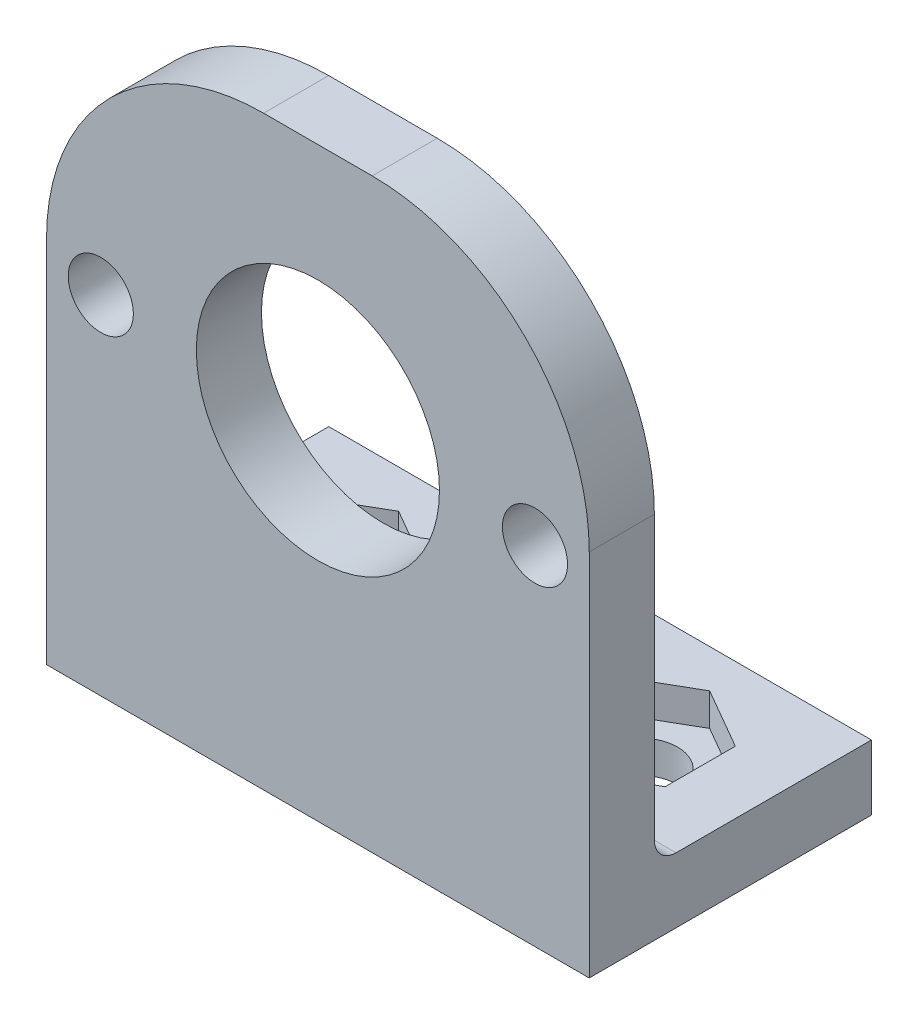
ISO-10303-21;
HEADER;
FILE_DESCRIPTION(('STEP AP214'),'2;1');
FILE_NAME('part.step','',(''),(''),'','','');
FILE_SCHEMA(('AUTOMOTIVE_DESIGN { 1 0 10303 214 1 1 1 1 }'));
ENDSEC;
DATA;
#1=APPLICATION_CONTEXT('core data for automotive mechanical design processes');
#2=APPLICATION_PROTOCOL_DEFINITION('international standard','automotive_design',2000,#1);
#3=PRODUCT_CONTEXT('',#1,'mechanical');
#4=PRODUCT('Part','Part','',(#3));
#5=PRODUCT_RELATED_PRODUCT_CATEGORY('part','',(#4));
#6=PRODUCT_DEFINITION_FORMATION('','',#4);
#7=PRODUCT_DEFINITION_CONTEXT('part definition',#1,'design');
#8=PRODUCT_DEFINITION('design','',#6,#7);
#9=PRODUCT_DEFINITION_SHAPE('','',#8);
#10=(LENGTH_UNIT() NAMED_UNIT(*) SI_UNIT(.MILLI.,.METRE.));
#11=(NAMED_UNIT(*) PLANE_ANGLE_UNIT() SI_UNIT($,.RADIAN.));
#12=(NAMED_UNIT(*) SI_UNIT($,.STERADIAN.) SOLID_ANGLE_UNIT());
#13=UNCERTAINTY_MEASURE_WITH_UNIT(LENGTH_MEASURE(1.E-05),#10,'distance_accuracy_value','');
#14=(GEOMETRIC_REPRESENTATION_CONTEXT(3) GLOBAL_UNCERTAINTY_ASSIGNED_CONTEXT((#13)) GLOBAL_UNIT_ASSIGNED_CONTEXT((#10,
#11,#12)) REPRESENTATION_CONTEXT('',''));
#15=CARTESIAN_POINT('',(0.,0.,0.));
#16=DIRECTION('',(0.,0.,1.));
#17=DIRECTION('',(1.,0.,0.));
#18=AXIS2_PLACEMENT_3D('',#15,#16,#17);
#19=CARTESIAN_POINT('',(6.81278026529184,-3.5,-5.));
#20=DIRECTION('',(0.,-1.,0.));
#21=DIRECTION('',(0.,0.,-1.));
#22=AXIS2_PLACEMENT_3D('',#19,#20,#21);
#23=CYLINDRICAL_SURFACE('',#22,1.75);
#24=CARTESIAN_POINT('',(6.81278026529184,-13.5,-5.));
#25=DIRECTION('',(0.,-1.,0.));
#26=DIRECTION('',(0.,0.,-1.));
#27=AXIS2_PLACEMENT_3D('',#24,#25,#26);
#28=CIRCLE('',#27,1.75);
#29=CARTESIAN_POINT('',(6.81278026529184,-13.5,-6.75));
#30=VERTEX_POINT('',#29);
#31=EDGE_CURVE('E288',#30,#30,#28,.T.);
#32=ORIENTED_EDGE('',*,*,#31,.T.);
#33=EDGE_LOOP('',(#32));
#34=FACE_BOUND('',#33,.T.);
#35=CARTESIAN_POINT('',(6.81278026529184,-12.0039970332876,-5.));
#36=DIRECTION('',(0.,1.,0.));
#37=DIRECTION('',(0.,0.,1.));
#38=AXIS2_PLACEMENT_3D('',#35,#36,#37);
#39=CIRCLE('',#38,1.75);
#40=CARTESIAN_POINT('',(6.81278026529184,-12.0039970332876,-3.25));
#41=VERTEX_POINT('',#40);
#42=EDGE_CURVE('E39',#41,#41,#39,.F.);
#43=ORIENTED_EDGE('',*,*,#42,.F.);
#44=EDGE_LOOP('',(#43));
#45=FACE_BOUND('',#44,.T.);
#46=ADVANCED_FACE('F35',(#34,#45),#23,.F.);
#47=CARTESIAN_POINT('',(-7.51338532803462,-3.5,-5.));
#48=DIRECTION('',(0.,-1.,0.));
#49=DIRECTION('',(0.,0.,-1.));
#50=AXIS2_PLACEMENT_3D('',#47,#48,#49);
#51=CYLINDRICAL_SURFACE('',#50,1.75);
#52=CARTESIAN_POINT('',(-7.51338532803462,-13.5,-5.));
#53=DIRECTION('',(0.,-1.,0.));
#54=DIRECTION('',(0.,0.,-1.));
#55=AXIS2_PLACEMENT_3D('',#52,#53,#54);
#56=CIRCLE('',#55,1.75);
#57=CARTESIAN_POINT('',(-7.51338532803462,-13.5,-6.75));
#58=VERTEX_POINT('',#57);
#59=EDGE_CURVE('E284',#58,#58,#56,.T.);
#60=ORIENTED_EDGE('',*,*,#59,.T.);
#61=EDGE_LOOP('',(#60));
#62=FACE_BOUND('',#61,.T.);
#63=CARTESIAN_POINT('',(-7.51338532803462,-12.0039970332876,-5.));
#64=DIRECTION('',(0.,1.,0.));
#65=DIRECTION('',(0.,0.,1.));
#66=AXIS2_PLACEMENT_3D('',#63,#64,#65);
#67=CIRCLE('',#66,1.75);
#68=CARTESIAN_POINT('',(-7.51338532803462,-12.0039970332876,-3.25));
#69=VERTEX_POINT('',#68);
#70=EDGE_CURVE('E231',#69,#69,#67,.F.);
#71=ORIENTED_EDGE('',*,*,#70,.F.);
#72=EDGE_LOOP('',(#71));
#73=FACE_BOUND('',#72,.T.);
#74=ADVANCED_FACE('F365',(#62,#73),#51,.F.);
#75=CARTESIAN_POINT('',(0.,0.,0.));
#76=DIRECTION('',(0.,0.,1.));
#77=DIRECTION('',(1.,0.,0.));
#78=AXIS2_PLACEMENT_3D('',#75,#76,#77);
#79=PLANE('',#78);
#80=CARTESIAN_POINT('',(-10.,2.5,0.));
#81=DIRECTION('',(0.,0.,1.));
#82=DIRECTION('',(1.,0.,0.));
#83=AXIS2_PLACEMENT_3D('',#80,#81,#82);
#84=CIRCLE('',#83,1.5);
#85=CARTESIAN_POINT('',(-8.5,2.5,0.));
#86=VERTEX_POINT('',#85);
#87=EDGE_CURVE('E207',#86,#86,#84,.T.);
#88=ORIENTED_EDGE('',*,*,#87,.T.);
#89=EDGE_LOOP('',(#88));
#90=FACE_BOUND('',#89,.T.);
#91=CARTESIAN_POINT('',(10.,2.5,0.));
#92=DIRECTION('',(0.,0.,1.));
#93=DIRECTION('',(1.,0.,0.));
#94=AXIS2_PLACEMENT_3D('',#91,#92,#93);
#95=CIRCLE('',#94,1.5);
#96=CARTESIAN_POINT('',(11.5,2.5,0.));
#97=VERTEX_POINT('',#96);
#98=EDGE_CURVE('E535',#97,#97,#95,.T.);
#99=ORIENTED_EDGE('',*,*,#98,.T.);
#100=EDGE_LOOP('',(#99));
#101=FACE_BOUND('',#100,.T.);
#102=CARTESIAN_POINT('',(0.,2.5,0.));
#103=DIRECTION('',(0.,0.,1.));
#104=DIRECTION('',(1.,0.,0.));
#105=AXIS2_PLACEMENT_3D('',#102,#103,#104);
#106=CIRCLE('',#105,5.6);
#107=CARTESIAN_POINT('',(5.6,2.5,0.));
#108=VERTEX_POINT('',#107);
#109=EDGE_CURVE('E293',#108,#108,#106,.T.);
#110=ORIENTED_EDGE('',*,*,#109,.T.);
#111=EDGE_LOOP('',(#110));
#112=FACE_BOUND('',#111,.T.);
#113=DIRECTION('',(0.,1.,0.));
#114=VECTOR('',#113,1.);
#115=CARTESIAN_POINT('',(12.5,13.5,0.));
#116=LINE('',#115,#114);
#117=CARTESIAN_POINT('',(12.5,-9.50399703328757,0.));
#118=VERTEX_POINT('',#117);
#119=CARTESIAN_POINT('',(12.5,3.5,0.));
#120=VERTEX_POINT('',#119);
#121=EDGE_CURVE('E312',#118,#120,#116,.T.);
#122=ORIENTED_EDGE('',*,*,#121,.F.);
#123=DIRECTION('',(1.,0.,0.));
#124=VECTOR('',#123,1.);
#125=CARTESIAN_POINT('',(-12.5,-9.50399703328757,0.));
#126=LINE('',#125,#124);
#127=CARTESIAN_POINT('',(-12.5,-9.50399703328757,0.));
#128=VERTEX_POINT('',#127);
#129=EDGE_CURVE('E356',#118,#128,#126,.F.);
#130=ORIENTED_EDGE('',*,*,#129,.T.);
#131=DIRECTION('',(0.,-1.,0.));
#132=VECTOR('',#131,1.);
#133=CARTESIAN_POINT('',(-12.5,13.5,0.));
#134=LINE('',#133,#132);
#135=CARTESIAN_POINT('',(-12.5,3.5,0.));
#136=VERTEX_POINT('',#135);
#137=EDGE_CURVE('E317',#136,#128,#134,.T.);
#138=ORIENTED_EDGE('',*,*,#137,.F.);
#139=CARTESIAN_POINT('',(-2.5,3.5,0.));
#140=DIRECTION('',(0.,0.,1.));
#141=DIRECTION('',(1.,0.,0.));
#142=AXIS2_PLACEMENT_3D('',#139,#140,#141);
#143=CIRCLE('',#142,10.);
#144=CARTESIAN_POINT('',(-2.5,13.5,0.));
#145=VERTEX_POINT('',#144);
#146=EDGE_CURVE('E339',#136,#145,#143,.F.);
#147=ORIENTED_EDGE('',*,*,#146,.T.);
#148=DIRECTION('',(-1.,0.,0.));
#149=VECTOR('',#148,1.);
#150=CARTESIAN_POINT('',(-12.5,13.5,0.));
#151=LINE('',#150,#149);
#152=CARTESIAN_POINT('',(2.5,13.5,0.));
#153=VERTEX_POINT('',#152);
#154=EDGE_CURVE('E326',#153,#145,#151,.T.);
#155=ORIENTED_EDGE('',*,*,#154,.F.);
#156=CARTESIAN_POINT('',(2.5,3.5,0.));
#157=DIRECTION('',(0.,0.,1.));
#158=DIRECTION('',(1.,0.,0.));
#159=AXIS2_PLACEMENT_3D('',#156,#157,#158);
#160=CIRCLE('',#159,10.);
#161=EDGE_CURVE('E341',#153,#120,#160,.F.);
#162=ORIENTED_EDGE('',*,*,#161,.T.);
#163=EDGE_LOOP('',(#122,#130,#138,#147,#155,#162));
#164=FACE_BOUND('',#163,.T.);
#165=ADVANCED_FACE('F371',(#90,#101,#112,#164),#79,.F.);
#166=CARTESIAN_POINT('',(12.5,13.5,3.));
#167=DIRECTION('',(-1.,0.,0.));
#168=DIRECTION('',(0.,-1.,0.));
#169=AXIS2_PLACEMENT_3D('',#166,#167,#168);
#170=PLANE('',#169);
#171=DIRECTION('',(0.,0.,1.));
#172=VECTOR('',#171,1.);
#173=CARTESIAN_POINT('',(12.5,-10.5039970332876,-10.));
#174=LINE('',#173,#172);
#175=CARTESIAN_POINT('',(12.5,-10.5039970332876,-10.));
#176=VERTEX_POINT('',#175);
#177=CARTESIAN_POINT('',(12.5,-10.5039970332876,-0.999999999999999));
#178=VERTEX_POINT('',#177);
#179=EDGE_CURVE('E306',#176,#178,#174,.T.);
#180=ORIENTED_EDGE('',*,*,#179,.T.);
#181=CARTESIAN_POINT('',(12.5,-9.50399703328757,-0.999999999999999));
#182=DIRECTION('',(-1.,0.,0.));
#183=DIRECTION('',(0.,-1.,0.));
#184=AXIS2_PLACEMENT_3D('',#181,#182,#183);
#185=CIRCLE('',#184,1.);
#186=EDGE_CURVE('E44',#178,#118,#185,.T.);
#187=ORIENTED_EDGE('',*,*,#186,.T.);
#188=ORIENTED_EDGE('',*,*,#121,.T.);
#189=DIRECTION('',(0.,0.,-1.));
#190=VECTOR('',#189,1.);
#191=CARTESIAN_POINT('',(12.5,3.5,3.));
#192=LINE('',#191,#190);
#193=CARTESIAN_POINT('',(12.5,3.5,3.));
#194=VERTEX_POINT('',#193);
#195=EDGE_CURVE('E344',#120,#194,#192,.F.);
#196=ORIENTED_EDGE('',*,*,#195,.T.);
#197=DIRECTION('',(0.,1.,0.));
#198=VECTOR('',#197,1.);
#199=CARTESIAN_POINT('',(12.5,13.5,3.));
#200=LINE('',#199,#198);
#201=CARTESIAN_POINT('',(12.5,-13.5,3.));
#202=VERTEX_POINT('',#201);
#203=EDGE_CURVE('E313',#202,#194,#200,.T.);
#204=ORIENTED_EDGE('',*,*,#203,.F.);
#205=DIRECTION('',(0.,0.,-1.));
#206=VECTOR('',#205,1.);
#207=CARTESIAN_POINT('',(12.5,-13.5,3.));
#208=LINE('',#207,#206);
#209=CARTESIAN_POINT('',(12.5,-13.5,-10.));
#210=VERTEX_POINT('',#209);
#211=EDGE_CURVE('E324',#202,#210,#208,.T.);
#212=ORIENTED_EDGE('',*,*,#211,.T.);
#213=DIRECTION('',(0.,-1.,0.));
#214=VECTOR('',#213,1.);
#215=CARTESIAN_POINT('',(12.5,-13.5,-10.));
#216=LINE('',#215,#214);
#217=EDGE_CURVE('E296',#176,#210,#216,.T.);
#218=ORIENTED_EDGE('',*,*,#217,.F.);
#219=EDGE_LOOP('',(#180,#187,#188,#196,#204,#212,#218));
#220=FACE_BOUND('',#219,.T.);
#221=ADVANCED_FACE('F396',(#220),#170,.F.);
#222=CARTESIAN_POINT('',(-12.5,13.5,3.));
#223=DIRECTION('',(0.,-1.,0.));
#224=DIRECTION('',(0.,0.,-1.));
#225=AXIS2_PLACEMENT_3D('',#222,#223,#224);
#226=PLANE('',#225);
#227=DIRECTION('',(-1.,0.,0.));
#228=VECTOR('',#227,1.);
#229=CARTESIAN_POINT('',(-12.5,13.5,3.));
#230=LINE('',#229,#228);
#231=CARTESIAN_POINT('',(2.5,13.5,3.));
#232=VERTEX_POINT('',#231);
#233=CARTESIAN_POINT('',(-2.5,13.5,3.));
#234=VERTEX_POINT('',#233);
#235=EDGE_CURVE('E316',#232,#234,#230,.T.);
#236=ORIENTED_EDGE('',*,*,#235,.F.);
#237=DIRECTION('',(0.,0.,-1.));
#238=VECTOR('',#237,1.);
#239=CARTESIAN_POINT('',(2.5,13.5,3.));
#240=LINE('',#239,#238);
#241=EDGE_CURVE('E336',#232,#153,#240,.T.);
#242=ORIENTED_EDGE('',*,*,#241,.T.);
#243=ORIENTED_EDGE('',*,*,#154,.T.);
#244=DIRECTION('',(0.,0.,-1.));
#245=VECTOR('',#244,1.);
#246=CARTESIAN_POINT('',(-2.5,13.5,3.));
#247=LINE('',#246,#245);
#248=EDGE_CURVE('E334',#145,#234,#247,.F.);
#249=ORIENTED_EDGE('',*,*,#248,.T.);
#250=EDGE_LOOP('',(#236,#242,#243,#249));
#251=FACE_BOUND('',#250,.T.);
#252=ADVANCED_FACE('F404',(#251),#226,.F.);
#253=CARTESIAN_POINT('',(-12.5,13.5,3.));
#254=DIRECTION('',(1.,0.,0.));
#255=DIRECTION('',(0.,1.,0.));
#256=AXIS2_PLACEMENT_3D('',#253,#254,#255);
#257=PLANE('',#256);
#258=DIRECTION('',(0.,-1.,0.));
#259=VECTOR('',#258,1.);
#260=CARTESIAN_POINT('',(-12.5,13.5,3.));
#261=LINE('',#260,#259);
#262=CARTESIAN_POINT('',(-12.5,3.5,3.));
#263=VERTEX_POINT('',#262);
#264=CARTESIAN_POINT('',(-12.5,-13.5,3.));
#265=VERTEX_POINT('',#264);
#266=EDGE_CURVE('E320',#263,#265,#261,.T.);
#267=ORIENTED_EDGE('',*,*,#266,.F.);
#268=DIRECTION('',(0.,0.,-1.));
#269=VECTOR('',#268,1.);
#270=CARTESIAN_POINT('',(-12.5,3.5,3.));
#271=LINE('',#270,#269);
#272=EDGE_CURVE('E350',#263,#136,#271,.T.);
#273=ORIENTED_EDGE('',*,*,#272,.T.);
#274=ORIENTED_EDGE('',*,*,#137,.T.);
#275=CARTESIAN_POINT('',(-12.5,-9.50399703328757,-0.999999999999999));
#276=DIRECTION('',(1.,0.,0.));
#277=DIRECTION('',(0.,1.,0.));
#278=AXIS2_PLACEMENT_3D('',#275,#276,#277);
#279=CIRCLE('',#278,1.);
#280=CARTESIAN_POINT('',(-12.5,-10.5039970332876,-0.999999999999999));
#281=VERTEX_POINT('',#280);
#282=EDGE_CURVE('E11',#128,#281,#279,.T.);
#283=ORIENTED_EDGE('',*,*,#282,.T.);
#284=DIRECTION('',(0.,0.,1.));
#285=VECTOR('',#284,1.);
#286=CARTESIAN_POINT('',(-12.5,-10.5039970332876,-10.));
#287=LINE('',#286,#285);
#288=CARTESIAN_POINT('',(-12.5,-10.5039970332876,-10.));
#289=VERTEX_POINT('',#288);
#290=EDGE_CURVE('E309',#289,#281,#287,.T.);
#291=ORIENTED_EDGE('',*,*,#290,.F.);
#292=DIRECTION('',(0.,1.,0.));
#293=VECTOR('',#292,1.);
#294=CARTESIAN_POINT('',(-12.5,-13.5,-10.));
#295=LINE('',#294,#293);
#296=CARTESIAN_POINT('',(-12.5,-13.5,-10.));
#297=VERTEX_POINT('',#296);
#298=EDGE_CURVE('E302',#297,#289,#295,.T.);
#299=ORIENTED_EDGE('',*,*,#298,.F.);
#300=DIRECTION('',(0.,0.,-1.));
#301=VECTOR('',#300,1.);
#302=CARTESIAN_POINT('',(-12.5,-13.5,3.));
#303=LINE('',#302,#301);
#304=EDGE_CURVE('E332',#265,#297,#303,.T.);
#305=ORIENTED_EDGE('',*,*,#304,.F.);
#306=EDGE_LOOP('',(#267,#273,#274,#283,#291,#299,#305));
#307=FACE_BOUND('',#306,.T.);
#308=ADVANCED_FACE('F400',(#307),#257,.F.);
#309=CARTESIAN_POINT('',(-12.5,-13.5,3.));
#310=DIRECTION('',(0.,1.,0.));
#311=DIRECTION('',(0.,0.,1.));
#312=AXIS2_PLACEMENT_3D('',#309,#310,#311);
#313=PLANE('',#312);
#314=ORIENTED_EDGE('',*,*,#59,.F.);
#315=EDGE_LOOP('',(#314));
#316=FACE_BOUND('',#315,.T.);
#317=ORIENTED_EDGE('',*,*,#31,.F.);
#318=EDGE_LOOP('',(#317));
#319=FACE_BOUND('',#318,.T.);
#320=ORIENTED_EDGE('',*,*,#304,.T.);
#321=DIRECTION('',(-1.,0.,0.));
#322=VECTOR('',#321,1.);
#323=CARTESIAN_POINT('',(12.5,-13.5,-10.));
#324=LINE('',#323,#322);
#325=EDGE_CURVE('E299',#210,#297,#324,.T.);
#326=ORIENTED_EDGE('',*,*,#325,.F.);
#327=ORIENTED_EDGE('',*,*,#211,.F.);
#328=DIRECTION('',(1.,0.,0.));
#329=VECTOR('',#328,1.);
#330=CARTESIAN_POINT('',(-12.5,-13.5,3.));
#331=LINE('',#330,#329);
#332=EDGE_CURVE('E322',#265,#202,#331,.T.);
#333=ORIENTED_EDGE('',*,*,#332,.F.);
#334=EDGE_LOOP('',(#320,#326,#327,#333));
#335=FACE_BOUND('',#334,.T.);
#336=ADVANCED_FACE('F392',(#316,#319,#335),#313,.F.);
#337=CARTESIAN_POINT('',(0.,0.,3.));
#338=DIRECTION('',(0.,0.,1.));
#339=DIRECTION('',(1.,0.,0.));
#340=AXIS2_PLACEMENT_3D('',#337,#338,#339);
#341=PLANE('',#340);
#342=CARTESIAN_POINT('',(-10.,2.5,3.));
#343=DIRECTION('',(0.,0.,1.));
#344=DIRECTION('',(1.,0.,0.));
#345=AXIS2_PLACEMENT_3D('',#342,#343,#344);
#346=CIRCLE('',#345,1.5);
#347=CARTESIAN_POINT('',(-8.5,2.5,3.));
#348=VERTEX_POINT('',#347);
#349=EDGE_CURVE('E537',#348,#348,#346,.T.);
#350=ORIENTED_EDGE('',*,*,#349,.F.);
#351=EDGE_LOOP('',(#350));
#352=FACE_BOUND('',#351,.T.);
#353=CARTESIAN_POINT('',(10.,2.5,3.));
#354=DIRECTION('',(0.,0.,1.));
#355=DIRECTION('',(1.,0.,0.));
#356=AXIS2_PLACEMENT_3D('',#353,#354,#355);
#357=CIRCLE('',#356,1.5);
#358=CARTESIAN_POINT('',(11.5,2.5,3.));
#359=VERTEX_POINT('',#358);
#360=EDGE_CURVE('E532',#359,#359,#357,.T.);
#361=ORIENTED_EDGE('',*,*,#360,.F.);
#362=EDGE_LOOP('',(#361));
#363=FACE_BOUND('',#362,.T.);
#364=CARTESIAN_POINT('',(0.,2.5,3.));
#365=DIRECTION('',(0.,0.,1.));
#366=DIRECTION('',(1.,0.,0.));
#367=AXIS2_PLACEMENT_3D('',#364,#365,#366);
#368=CIRCLE('',#367,5.6);
#369=CARTESIAN_POINT('',(5.6,2.5,3.));
#370=VERTEX_POINT('',#369);
#371=EDGE_CURVE('E287',#370,#370,#368,.T.);
#372=ORIENTED_EDGE('',*,*,#371,.F.);
#373=EDGE_LOOP('',(#372));
#374=FACE_BOUND('',#373,.T.);
#375=ORIENTED_EDGE('',*,*,#203,.T.);
#376=CARTESIAN_POINT('',(2.5,3.5,3.));
#377=DIRECTION('',(0.,0.,1.));
#378=DIRECTION('',(1.,0.,0.));
#379=AXIS2_PLACEMENT_3D('',#376,#377,#378);
#380=CIRCLE('',#379,10.);
#381=EDGE_CURVE('E348',#194,#232,#380,.T.);
#382=ORIENTED_EDGE('',*,*,#381,.T.);
#383=ORIENTED_EDGE('',*,*,#235,.T.);
#384=CARTESIAN_POINT('',(-2.5,3.5,3.));
#385=DIRECTION('',(0.,0.,1.));
#386=DIRECTION('',(1.,0.,0.));
#387=AXIS2_PLACEMENT_3D('',#384,#385,#386);
#388=CIRCLE('',#387,10.);
#389=EDGE_CURVE('E346',#234,#263,#388,.T.);
#390=ORIENTED_EDGE('',*,*,#389,.T.);
#391=ORIENTED_EDGE('',*,*,#266,.T.);
#392=ORIENTED_EDGE('',*,*,#332,.T.);
#393=EDGE_LOOP('',(#375,#382,#383,#390,#391,#392));
#394=FACE_BOUND('',#393,.T.);
#395=ADVANCED_FACE('F388',(#352,#363,#374,#394),#341,.T.);
#396=CARTESIAN_POINT('',(12.5,-10.5039970332876,-10.));
#397=DIRECTION('',(0.,-1.,0.));
#398=DIRECTION('',(0.,0.,-1.));
#399=AXIS2_PLACEMENT_3D('',#396,#397,#398);
#400=PLANE('',#399);
#401=DIRECTION('',(0.,0.,-1.));
#402=VECTOR('',#401,1.);
#403=CARTESIAN_POINT('',(9.61278026529184,-10.5039970332876,-3.38341924626905));
#404=LINE('',#403,#402);
#405=CARTESIAN_POINT('',(9.61278026529184,-10.5039970332876,-3.38341924626905));
#406=VERTEX_POINT('',#405);
#407=CARTESIAN_POINT('',(9.61278026529184,-10.5039970332876,-6.61658075373095));
#408=VERTEX_POINT('',#407);
#409=EDGE_CURVE('E218',#406,#408,#404,.T.);
#410=ORIENTED_EDGE('',*,*,#409,.F.);
#411=DIRECTION('',(0.866025403784439,0.,-0.5));
#412=VECTOR('',#411,1.);
#413=CARTESIAN_POINT('',(6.81278026529184,-10.5039970332876,-1.76683849253809));
#414=LINE('',#413,#412);
#415=CARTESIAN_POINT('',(6.81278026529184,-10.5039970332876,-1.76683849253809));
#416=VERTEX_POINT('',#415);
#417=EDGE_CURVE('E52',#416,#406,#414,.T.);
#418=ORIENTED_EDGE('',*,*,#417,.F.);
#419=DIRECTION('',(0.866025403784439,0.,0.5));
#420=VECTOR('',#419,1.);
#421=CARTESIAN_POINT('',(4.01278026529184,-10.5039970332876,-3.38341924626905));
#422=LINE('',#421,#420);
#423=CARTESIAN_POINT('',(4.01278026529184,-10.5039970332876,-3.38341924626905));
#424=VERTEX_POINT('',#423);
#425=EDGE_CURVE('E201',#424,#416,#422,.T.);
#426=ORIENTED_EDGE('',*,*,#425,.F.);
#427=DIRECTION('',(0.,0.,1.));
#428=VECTOR('',#427,1.);
#429=CARTESIAN_POINT('',(4.01278026529184,-10.5039970332876,-6.61658075373096));
#430=LINE('',#429,#428);
#431=CARTESIAN_POINT('',(4.01278026529184,-10.5039970332876,-6.61658075373096));
#432=VERTEX_POINT('',#431);
#433=EDGE_CURVE('E204',#432,#424,#430,.T.);
#434=ORIENTED_EDGE('',*,*,#433,.F.);
#435=DIRECTION('',(-0.866025403784439,0.,0.5));
#436=VECTOR('',#435,1.);
#437=CARTESIAN_POINT('',(6.81278026529184,-10.5039970332876,-8.23316150746191));
#438=LINE('',#437,#436);
#439=CARTESIAN_POINT('',(6.81278026529184,-10.5039970332876,-8.23316150746191));
#440=VERTEX_POINT('',#439);
#441=EDGE_CURVE('E224',#440,#432,#438,.T.);
#442=ORIENTED_EDGE('',*,*,#441,.F.);
#443=DIRECTION('',(-0.866025403784439,0.,-0.5));
#444=VECTOR('',#443,1.);
#445=CARTESIAN_POINT('',(9.61278026529184,-10.5039970332876,-6.61658075373095));
#446=LINE('',#445,#444);
#447=EDGE_CURVE('E221',#408,#440,#446,.T.);
#448=ORIENTED_EDGE('',*,*,#447,.F.);
#449=EDGE_LOOP('',(#410,#418,#426,#434,#442,#448));
#450=FACE_BOUND('',#449,.T.);
#451=DIRECTION('',(0.,0.,-1.));
#452=VECTOR('',#451,1.);
#453=CARTESIAN_POINT('',(-4.71338532803462,-10.5039970332876,-3.38341924626905));
#454=LINE('',#453,#452);
#455=CARTESIAN_POINT('',(-4.71338532803462,-10.5039970332876,-3.38341924626905));
#456=VERTEX_POINT('',#455);
#457=CARTESIAN_POINT('',(-4.71338532803462,-10.5039970332876,-6.61658075373096));
#458=VERTEX_POINT('',#457);
#459=EDGE_CURVE('E260',#456,#458,#454,.T.);
#460=ORIENTED_EDGE('',*,*,#459,.F.);
#461=DIRECTION('',(0.866025403784439,0.,-0.5));
#462=VECTOR('',#461,1.);
#463=CARTESIAN_POINT('',(-7.51338532803462,-10.5039970332876,-1.7668384925381));
#464=LINE('',#463,#462);
#465=CARTESIAN_POINT('',(-7.51338532803462,-10.5039970332876,-1.7668384925381));
#466=VERTEX_POINT('',#465);
#467=EDGE_CURVE('E60',#466,#456,#464,.T.);
#468=ORIENTED_EDGE('',*,*,#467,.F.);
#469=DIRECTION('',(0.866025403784438,0.,0.5));
#470=VECTOR('',#469,1.);
#471=CARTESIAN_POINT('',(-10.3133853280346,-10.5039970332876,-3.38341924626905));
#472=LINE('',#471,#470);
#473=CARTESIAN_POINT('',(-10.3133853280346,-10.5039970332876,-3.38341924626905));
#474=VERTEX_POINT('',#473);
#475=EDGE_CURVE('E243',#474,#466,#472,.T.);
#476=ORIENTED_EDGE('',*,*,#475,.F.);
#477=DIRECTION('',(0.,0.,1.));
#478=VECTOR('',#477,1.);
#479=CARTESIAN_POINT('',(-10.3133853280346,-10.5039970332876,-6.61658075373095));
#480=LINE('',#479,#478);
#481=CARTESIAN_POINT('',(-10.3133853280346,-10.5039970332876,-6.61658075373095));
#482=VERTEX_POINT('',#481);
#483=EDGE_CURVE('E269',#482,#474,#480,.T.);
#484=ORIENTED_EDGE('',*,*,#483,.F.);
#485=DIRECTION('',(-0.866025403784439,0.,0.5));
#486=VECTOR('',#485,1.);
#487=CARTESIAN_POINT('',(-7.51338532803462,-10.5039970332876,-8.23316150746191));
#488=LINE('',#487,#486);
#489=CARTESIAN_POINT('',(-7.51338532803462,-10.5039970332876,-8.23316150746191));
#490=VERTEX_POINT('',#489);
#491=EDGE_CURVE('E266',#490,#482,#488,.T.);
#492=ORIENTED_EDGE('',*,*,#491,.F.);
#493=DIRECTION('',(-0.866025403784438,0.,-0.5));
#494=VECTOR('',#493,1.);
#495=CARTESIAN_POINT('',(-4.71338532803462,-10.5039970332876,-6.61658075373096));
#496=LINE('',#495,#494);
#497=EDGE_CURVE('E263',#458,#490,#496,.T.);
#498=ORIENTED_EDGE('',*,*,#497,.F.);
#499=EDGE_LOOP('',(#460,#468,#476,#484,#492,#498));
#500=FACE_BOUND('',#499,.T.);
#501=ORIENTED_EDGE('',*,*,#290,.T.);
#502=DIRECTION('',(1.,0.,0.));
#503=VECTOR('',#502,1.);
#504=CARTESIAN_POINT('',(12.5,-10.5039970332876,-0.999999999999999));
#505=LINE('',#504,#503);
#506=EDGE_CURVE('E353',#281,#178,#505,.T.);
#507=ORIENTED_EDGE('',*,*,#506,.T.);
#508=ORIENTED_EDGE('',*,*,#179,.F.);
#509=DIRECTION('',(1.,0.,0.));
#510=VECTOR('',#509,1.);
#511=CARTESIAN_POINT('',(12.5,-10.5039970332876,-10.));
#512=LINE('',#511,#510);
#513=EDGE_CURVE('E304',#289,#176,#512,.T.);
#514=ORIENTED_EDGE('',*,*,#513,.F.);
#515=EDGE_LOOP('',(#501,#507,#508,#514));
#516=FACE_BOUND('',#515,.T.);
#517=ADVANCED_FACE('F384',(#450,#500,#516),#400,.F.);
#518=CARTESIAN_POINT('',(0.,0.,-10.));
#519=DIRECTION('',(0.,0.,1.));
#520=DIRECTION('',(1.,0.,0.));
#521=AXIS2_PLACEMENT_3D('',#518,#519,#520);
#522=PLANE('',#521);
#523=ORIENTED_EDGE('',*,*,#217,.T.);
#524=ORIENTED_EDGE('',*,*,#325,.T.);
#525=ORIENTED_EDGE('',*,*,#298,.T.);
#526=ORIENTED_EDGE('',*,*,#513,.T.);
#527=EDGE_LOOP('',(#523,#524,#525,#526));
#528=FACE_BOUND('',#527,.T.);
#529=ADVANCED_FACE('F380',(#528),#522,.F.);
#530=CARTESIAN_POINT('',(0.,2.5,-7.));
#531=DIRECTION('',(0.,0.,1.));
#532=DIRECTION('',(1.,0.,0.));
#533=AXIS2_PLACEMENT_3D('',#530,#531,#532);
#534=CYLINDRICAL_SURFACE('',#533,5.6);
#535=ORIENTED_EDGE('',*,*,#371,.T.);
#536=EDGE_LOOP('',(#535));
#537=FACE_BOUND('',#536,.T.);
#538=ORIENTED_EDGE('',*,*,#109,.F.);
#539=EDGE_LOOP('',(#538));
#540=FACE_BOUND('',#539,.T.);
#541=ADVANCED_FACE('F376',(#537,#540),#534,.F.);
#542=CARTESIAN_POINT('',(2.5,3.5,3.));
#543=DIRECTION('',(0.,0.,-1.));
#544=DIRECTION('',(-1.,0.,0.));
#545=AXIS2_PLACEMENT_3D('',#542,#543,#544);
#546=CYLINDRICAL_SURFACE('',#545,10.);
#547=ORIENTED_EDGE('',*,*,#381,.F.);
#548=ORIENTED_EDGE('',*,*,#195,.F.);
#549=ORIENTED_EDGE('',*,*,#161,.F.);
#550=ORIENTED_EDGE('',*,*,#241,.F.);
#551=EDGE_LOOP('',(#547,#548,#549,#550));
#552=FACE_BOUND('',#551,.T.);
#553=ADVANCED_FACE('F379',(#552),#546,.T.);
#554=CARTESIAN_POINT('',(-2.5,3.5,3.));
#555=DIRECTION('',(0.,0.,-1.));
#556=DIRECTION('',(-1.,0.,0.));
#557=AXIS2_PLACEMENT_3D('',#554,#555,#556);
#558=CYLINDRICAL_SURFACE('',#557,10.);
#559=ORIENTED_EDGE('',*,*,#389,.F.);
#560=ORIENTED_EDGE('',*,*,#248,.F.);
#561=ORIENTED_EDGE('',*,*,#146,.F.);
#562=ORIENTED_EDGE('',*,*,#272,.F.);
#563=EDGE_LOOP('',(#559,#560,#561,#562));
#564=FACE_BOUND('',#563,.T.);
#565=ADVANCED_FACE('F413',(#564),#558,.T.);
#566=CARTESIAN_POINT('',(12.5,-9.50399703328757,-0.999999999999999));
#567=DIRECTION('',(-1.,0.,0.));
#568=DIRECTION('',(0.,0.,1.));
#569=AXIS2_PLACEMENT_3D('',#566,#567,#568);
#570=CYLINDRICAL_SURFACE('',#569,1.);
#571=ORIENTED_EDGE('',*,*,#282,.F.);
#572=ORIENTED_EDGE('',*,*,#129,.F.);
#573=ORIENTED_EDGE('',*,*,#186,.F.);
#574=ORIENTED_EDGE('',*,*,#506,.F.);
#575=EDGE_LOOP('',(#571,#572,#573,#574));
#576=FACE_BOUND('',#575,.T.);
#577=ADVANCED_FACE('F37',(#576),#570,.F.);
#578=CARTESIAN_POINT('',(0.,-12.0039970332876,0.));
#579=DIRECTION('',(0.,1.,0.));
#580=DIRECTION('',(0.,0.,1.));
#581=AXIS2_PLACEMENT_3D('',#578,#579,#580);
#582=PLANE('',#581);
#583=DIRECTION('',(0.866025403784439,0.,-0.5));
#584=VECTOR('',#583,1.);
#585=CARTESIAN_POINT('',(-7.51338532803462,-12.0039970332876,-1.7668384925381));
#586=LINE('',#585,#584);
#587=CARTESIAN_POINT('',(-7.51338532803462,-12.0039970332876,-1.7668384925381));
#588=VERTEX_POINT('',#587);
#589=CARTESIAN_POINT('',(-4.71338532803462,-12.0039970332876,-3.38341924626905));
#590=VERTEX_POINT('',#589);
#591=EDGE_CURVE('E239',#588,#590,#586,.T.);
#592=ORIENTED_EDGE('',*,*,#591,.T.);
#593=DIRECTION('',(0.,0.,-1.));
#594=VECTOR('',#593,1.);
#595=CARTESIAN_POINT('',(-4.71338532803462,-12.0039970332876,-3.38341924626905));
#596=LINE('',#595,#594);
#597=CARTESIAN_POINT('',(-4.71338532803462,-12.0039970332876,-6.61658075373096));
#598=VERTEX_POINT('',#597);
#599=EDGE_CURVE('E242',#590,#598,#596,.T.);
#600=ORIENTED_EDGE('',*,*,#599,.T.);
#601=DIRECTION('',(-0.866025403784438,0.,-0.5));
#602=VECTOR('',#601,1.);
#603=CARTESIAN_POINT('',(-4.71338532803462,-12.0039970332876,-6.61658075373096));
#604=LINE('',#603,#602);
#605=CARTESIAN_POINT('',(-7.51338532803462,-12.0039970332876,-8.23316150746191));
#606=VERTEX_POINT('',#605);
#607=EDGE_CURVE('E246',#598,#606,#604,.T.);
#608=ORIENTED_EDGE('',*,*,#607,.T.);
#609=DIRECTION('',(-0.866025403784439,0.,0.5));
#610=VECTOR('',#609,1.);
#611=CARTESIAN_POINT('',(-7.51338532803462,-12.0039970332876,-8.23316150746191));
#612=LINE('',#611,#610);
#613=CARTESIAN_POINT('',(-10.3133853280346,-12.0039970332876,-6.61658075373095));
#614=VERTEX_POINT('',#613);
#615=EDGE_CURVE('E249',#606,#614,#612,.T.);
#616=ORIENTED_EDGE('',*,*,#615,.T.);
#617=DIRECTION('',(0.,0.,1.));
#618=VECTOR('',#617,1.);
#619=CARTESIAN_POINT('',(-10.3133853280346,-12.0039970332876,-6.61658075373095));
#620=LINE('',#619,#618);
#621=CARTESIAN_POINT('',(-10.3133853280346,-12.0039970332876,-3.38341924626905));
#622=VERTEX_POINT('',#621);
#623=EDGE_CURVE('E252',#614,#622,#620,.T.);
#624=ORIENTED_EDGE('',*,*,#623,.T.);
#625=DIRECTION('',(0.866025403784438,0.,0.5));
#626=VECTOR('',#625,1.);
#627=CARTESIAN_POINT('',(-10.3133853280346,-12.0039970332876,-3.38341924626905));
#628=LINE('',#627,#626);
#629=EDGE_CURVE('E255',#622,#588,#628,.T.);
#630=ORIENTED_EDGE('',*,*,#629,.T.);
#631=EDGE_LOOP('',(#592,#600,#608,#616,#624,#630));
#632=FACE_BOUND('',#631,.T.);
#633=ORIENTED_EDGE('',*,*,#70,.T.);
#634=EDGE_LOOP('',(#633));
#635=FACE_BOUND('',#634,.T.);
#636=ADVANCED_FACE('F420',(#632,#635),#582,.T.);
#637=CARTESIAN_POINT('',(-7.51338532803462,-12.0039970332876,-1.7668384925381));
#638=DIRECTION('',(0.5,0.,0.866025403784439));
#639=DIRECTION('',(0.866025403784439,0.,-0.5));
#640=AXIS2_PLACEMENT_3D('',#637,#638,#639);
#641=PLANE('',#640);
#642=ORIENTED_EDGE('',*,*,#467,.T.);
#643=DIRECTION('',(0.,1.,0.));
#644=VECTOR('',#643,1.);
#645=CARTESIAN_POINT('',(-4.71338532803462,-12.0039970332876,-3.38341924626905));
#646=LINE('',#645,#644);
#647=EDGE_CURVE('E258',#590,#456,#646,.T.);
#648=ORIENTED_EDGE('',*,*,#647,.F.);
#649=ORIENTED_EDGE('',*,*,#591,.F.);
#650=DIRECTION('',(0.,1.,0.));
#651=VECTOR('',#650,1.);
#652=CARTESIAN_POINT('',(-7.51338532803462,-12.0039970332876,-1.7668384925381));
#653=LINE('',#652,#651);
#654=EDGE_CURVE('E219',#588,#466,#653,.T.);
#655=ORIENTED_EDGE('',*,*,#654,.T.);
#656=EDGE_LOOP('',(#642,#648,#649,#655));
#657=FACE_BOUND('',#656,.T.);
#658=ADVANCED_FACE('F453',(#657),#641,.F.);
#659=CARTESIAN_POINT('',(-10.3133853280346,-12.0039970332876,-3.38341924626905));
#660=DIRECTION('',(-0.5,0.,0.866025403784438));
#661=DIRECTION('',(0.866025403784438,0.,0.5));
#662=AXIS2_PLACEMENT_3D('',#659,#660,#661);
#663=PLANE('',#662);
#664=ORIENTED_EDGE('',*,*,#475,.T.);
#665=ORIENTED_EDGE('',*,*,#654,.F.);
#666=ORIENTED_EDGE('',*,*,#629,.F.);
#667=DIRECTION('',(0.,1.,0.));
#668=VECTOR('',#667,1.);
#669=CARTESIAN_POINT('',(-10.3133853280346,-12.0039970332876,-3.38341924626905));
#670=LINE('',#669,#668);
#671=EDGE_CURVE('E275',#622,#474,#670,.T.);
#672=ORIENTED_EDGE('',*,*,#671,.T.);
#673=EDGE_LOOP('',(#664,#665,#666,#672));
#674=FACE_BOUND('',#673,.T.);
#675=ADVANCED_FACE('F459',(#674),#663,.F.);
#676=CARTESIAN_POINT('',(-10.3133853280346,-12.0039970332876,-6.61658075373095));
#677=DIRECTION('',(-1.,0.,0.));
#678=DIRECTION('',(0.,0.,1.));
#679=AXIS2_PLACEMENT_3D('',#676,#677,#678);
#680=PLANE('',#679);
#681=ORIENTED_EDGE('',*,*,#483,.T.);
#682=ORIENTED_EDGE('',*,*,#671,.F.);
#683=ORIENTED_EDGE('',*,*,#623,.F.);
#684=DIRECTION('',(0.,1.,0.));
#685=VECTOR('',#684,1.);
#686=CARTESIAN_POINT('',(-10.3133853280346,-12.0039970332876,-6.61658075373095));
#687=LINE('',#686,#685);
#688=EDGE_CURVE('E277',#614,#482,#687,.T.);
#689=ORIENTED_EDGE('',*,*,#688,.T.);
#690=EDGE_LOOP('',(#681,#682,#683,#689));
#691=FACE_BOUND('',#690,.T.);
#692=ADVANCED_FACE('F465',(#691),#680,.F.);
#693=CARTESIAN_POINT('',(-7.51338532803462,-12.0039970332876,-8.23316150746191));
#694=DIRECTION('',(-0.5,0.,-0.866025403784439));
#695=DIRECTION('',(-0.866025403784439,0.,0.5));
#696=AXIS2_PLACEMENT_3D('',#693,#694,#695);
#697=PLANE('',#696);
#698=ORIENTED_EDGE('',*,*,#491,.T.);
#699=ORIENTED_EDGE('',*,*,#688,.F.);
#700=ORIENTED_EDGE('',*,*,#615,.F.);
#701=DIRECTION('',(0.,1.,0.));
#702=VECTOR('',#701,1.);
#703=CARTESIAN_POINT('',(-7.51338532803462,-12.0039970332876,-8.23316150746191));
#704=LINE('',#703,#702);
#705=EDGE_CURVE('E279',#606,#490,#704,.T.);
#706=ORIENTED_EDGE('',*,*,#705,.T.);
#707=EDGE_LOOP('',(#698,#699,#700,#706));
#708=FACE_BOUND('',#707,.T.);
#709=ADVANCED_FACE('F469',(#708),#697,.F.);
#710=CARTESIAN_POINT('',(-4.71338532803462,-12.0039970332876,-6.61658075373096));
#711=DIRECTION('',(0.500000000000001,0.,-0.866025403784438));
#712=DIRECTION('',(-0.866025403784438,0.,-0.500000000000001));
#713=AXIS2_PLACEMENT_3D('',#710,#711,#712);
#714=PLANE('',#713);
#715=ORIENTED_EDGE('',*,*,#497,.T.);
#716=ORIENTED_EDGE('',*,*,#705,.F.);
#717=ORIENTED_EDGE('',*,*,#607,.F.);
#718=DIRECTION('',(0.,1.,0.));
#719=VECTOR('',#718,1.);
#720=CARTESIAN_POINT('',(-4.71338532803462,-12.0039970332876,-6.61658075373096));
#721=LINE('',#720,#719);
#722=EDGE_CURVE('E281',#598,#458,#721,.T.);
#723=ORIENTED_EDGE('',*,*,#722,.T.);
#724=EDGE_LOOP('',(#715,#716,#717,#723));
#725=FACE_BOUND('',#724,.T.);
#726=ADVANCED_FACE('F473',(#725),#714,.F.);
#727=CARTESIAN_POINT('',(-4.71338532803462,-12.0039970332876,-3.38341924626905));
#728=DIRECTION('',(1.,0.,0.));
#729=DIRECTION('',(0.,0.,-1.));
#730=AXIS2_PLACEMENT_3D('',#727,#728,#729);
#731=PLANE('',#730);
#732=ORIENTED_EDGE('',*,*,#459,.T.);
#733=ORIENTED_EDGE('',*,*,#722,.F.);
#734=ORIENTED_EDGE('',*,*,#599,.F.);
#735=ORIENTED_EDGE('',*,*,#647,.T.);
#736=EDGE_LOOP('',(#732,#733,#734,#735));
#737=FACE_BOUND('',#736,.T.);
#738=ADVANCED_FACE('F477',(#737),#731,.F.);
#739=CARTESIAN_POINT('',(0.,-12.0039970332876,0.));
#740=DIRECTION('',(0.,1.,0.));
#741=DIRECTION('',(0.,0.,1.));
#742=AXIS2_PLACEMENT_3D('',#739,#740,#741);
#743=PLANE('',#742);
#744=DIRECTION('',(0.866025403784439,0.,-0.5));
#745=VECTOR('',#744,1.);
#746=CARTESIAN_POINT('',(6.81278026529184,-12.0039970332876,-1.76683849253809));
#747=LINE('',#746,#745);
#748=CARTESIAN_POINT('',(6.81278026529184,-12.0039970332876,-1.76683849253809));
#749=VERTEX_POINT('',#748);
#750=CARTESIAN_POINT('',(9.61278026529184,-12.0039970332876,-3.38341924626905));
#751=VERTEX_POINT('',#750);
#752=EDGE_CURVE('E181',#749,#751,#747,.T.);
#753=ORIENTED_EDGE('',*,*,#752,.T.);
#754=DIRECTION('',(0.,0.,-1.));
#755=VECTOR('',#754,1.);
#756=CARTESIAN_POINT('',(9.61278026529184,-12.0039970332876,-3.38341924626905));
#757=LINE('',#756,#755);
#758=CARTESIAN_POINT('',(9.61278026529184,-12.0039970332876,-6.61658075373095));
#759=VERTEX_POINT('',#758);
#760=EDGE_CURVE('E190',#751,#759,#757,.T.);
#761=ORIENTED_EDGE('',*,*,#760,.T.);
#762=DIRECTION('',(-0.866025403784439,0.,-0.5));
#763=VECTOR('',#762,1.);
#764=CARTESIAN_POINT('',(9.61278026529184,-12.0039970332876,-6.61658075373095));
#765=LINE('',#764,#763);
#766=CARTESIAN_POINT('',(6.81278026529184,-12.0039970332876,-8.23316150746191));
#767=VERTEX_POINT('',#766);
#768=EDGE_CURVE('E195',#759,#767,#765,.T.);
#769=ORIENTED_EDGE('',*,*,#768,.T.);
#770=DIRECTION('',(-0.866025403784439,0.,0.5));
#771=VECTOR('',#770,1.);
#772=CARTESIAN_POINT('',(6.81278026529184,-12.0039970332876,-8.23316150746191));
#773=LINE('',#772,#771);
#774=CARTESIAN_POINT('',(4.01278026529184,-12.0039970332876,-6.61658075373096));
#775=VERTEX_POINT('',#774);
#776=EDGE_CURVE('E211',#767,#775,#773,.T.);
#777=ORIENTED_EDGE('',*,*,#776,.T.);
#778=DIRECTION('',(0.,0.,1.));
#779=VECTOR('',#778,1.);
#780=CARTESIAN_POINT('',(4.01278026529184,-12.0039970332876,-6.61658075373096));
#781=LINE('',#780,#779);
#782=CARTESIAN_POINT('',(4.01278026529184,-12.0039970332876,-3.38341924626905));
#783=VERTEX_POINT('',#782);
#784=EDGE_CURVE('E214',#775,#783,#781,.T.);
#785=ORIENTED_EDGE('',*,*,#784,.T.);
#786=DIRECTION('',(0.866025403784439,0.,0.5));
#787=VECTOR('',#786,1.);
#788=CARTESIAN_POINT('',(4.01278026529184,-12.0039970332876,-3.38341924626905));
#789=LINE('',#788,#787);
#790=EDGE_CURVE('E187',#783,#749,#789,.T.);
#791=ORIENTED_EDGE('',*,*,#790,.T.);
#792=EDGE_LOOP('',(#753,#761,#769,#777,#785,#791));
#793=FACE_BOUND('',#792,.T.);
#794=ORIENTED_EDGE('',*,*,#42,.T.);
#795=EDGE_LOOP('',(#794));
#796=FACE_BOUND('',#795,.T.);
#797=ADVANCED_FACE('F197',(#793,#796),#743,.T.);
#798=CARTESIAN_POINT('',(6.81278026529184,-12.0039970332876,-1.76683849253809));
#799=DIRECTION('',(0.5,0.,0.866025403784439));
#800=DIRECTION('',(0.866025403784439,0.,-0.5));
#801=AXIS2_PLACEMENT_3D('',#798,#799,#800);
#802=PLANE('',#801);
#803=ORIENTED_EDGE('',*,*,#417,.T.);
#804=DIRECTION('',(0.,1.,0.));
#805=VECTOR('',#804,1.);
#806=CARTESIAN_POINT('',(9.61278026529184,-12.0039970332876,-3.38341924626905));
#807=LINE('',#806,#805);
#808=EDGE_CURVE('E177',#751,#406,#807,.T.);
#809=ORIENTED_EDGE('',*,*,#808,.F.);
#810=ORIENTED_EDGE('',*,*,#752,.F.);
#811=DIRECTION('',(0.,1.,0.));
#812=VECTOR('',#811,1.);
#813=CARTESIAN_POINT('',(6.81278026529184,-12.0039970332876,-1.76683849253809));
#814=LINE('',#813,#812);
#815=EDGE_CURVE('E229',#749,#416,#814,.T.);
#816=ORIENTED_EDGE('',*,*,#815,.T.);
#817=EDGE_LOOP('',(#803,#809,#810,#816));
#818=FACE_BOUND('',#817,.T.);
#819=ADVANCED_FACE('F179',(#818),#802,.F.);
#820=CARTESIAN_POINT('',(4.01278026529184,-12.0039970332876,-3.38341924626905));
#821=DIRECTION('',(-0.5,0.,0.866025403784439));
#822=DIRECTION('',(0.866025403784439,0.,0.5));
#823=AXIS2_PLACEMENT_3D('',#820,#821,#822);
#824=PLANE('',#823);
#825=ORIENTED_EDGE('',*,*,#425,.T.);
#826=ORIENTED_EDGE('',*,*,#815,.F.);
#827=ORIENTED_EDGE('',*,*,#790,.F.);
#828=DIRECTION('',(0.,1.,0.));
#829=VECTOR('',#828,1.);
#830=CARTESIAN_POINT('',(4.01278026529184,-12.0039970332876,-3.38341924626905));
#831=LINE('',#830,#829);
#832=EDGE_CURVE('E232',#783,#424,#831,.T.);
#833=ORIENTED_EDGE('',*,*,#832,.T.);
#834=EDGE_LOOP('',(#825,#826,#827,#833));
#835=FACE_BOUND('',#834,.T.);
#836=ADVANCED_FACE('F500',(#835),#824,.F.);
#837=CARTESIAN_POINT('',(4.01278026529184,-12.0039970332876,-6.61658075373096));
#838=DIRECTION('',(-1.,0.,0.));
#839=DIRECTION('',(0.,0.,1.));
#840=AXIS2_PLACEMENT_3D('',#837,#838,#839);
#841=PLANE('',#840);
#842=ORIENTED_EDGE('',*,*,#433,.T.);
#843=ORIENTED_EDGE('',*,*,#832,.F.);
#844=ORIENTED_EDGE('',*,*,#784,.F.);
#845=DIRECTION('',(0.,1.,0.));
#846=VECTOR('',#845,1.);
#847=CARTESIAN_POINT('',(4.01278026529184,-12.0039970332876,-6.61658075373096));
#848=LINE('',#847,#846);
#849=EDGE_CURVE('E234',#775,#432,#848,.T.);
#850=ORIENTED_EDGE('',*,*,#849,.T.);
#851=EDGE_LOOP('',(#842,#843,#844,#850));
#852=FACE_BOUND('',#851,.T.);
#853=ADVANCED_FACE('F507',(#852),#841,.F.);
#854=CARTESIAN_POINT('',(6.81278026529184,-12.0039970332876,-8.23316150746191));
#855=DIRECTION('',(-0.5,0.,-0.866025403784439));
#856=DIRECTION('',(-0.866025403784439,0.,0.5));
#857=AXIS2_PLACEMENT_3D('',#854,#855,#856);
#858=PLANE('',#857);
#859=ORIENTED_EDGE('',*,*,#441,.T.);
#860=ORIENTED_EDGE('',*,*,#849,.F.);
#861=ORIENTED_EDGE('',*,*,#776,.F.);
#862=DIRECTION('',(0.,1.,0.));
#863=VECTOR('',#862,1.);
#864=CARTESIAN_POINT('',(6.81278026529184,-12.0039970332876,-8.23316150746191));
#865=LINE('',#864,#863);
#866=EDGE_CURVE('E236',#767,#440,#865,.T.);
#867=ORIENTED_EDGE('',*,*,#866,.T.);
#868=EDGE_LOOP('',(#859,#860,#861,#867));
#869=FACE_BOUND('',#868,.T.);
#870=ADVANCED_FACE('F511',(#869),#858,.F.);
#871=CARTESIAN_POINT('',(9.61278026529184,-12.0039970332876,-6.61658075373095));
#872=DIRECTION('',(0.5,0.,-0.866025403784439));
#873=DIRECTION('',(-0.866025403784439,0.,-0.5));
#874=AXIS2_PLACEMENT_3D('',#871,#872,#873);
#875=PLANE('',#874);
#876=ORIENTED_EDGE('',*,*,#447,.T.);
#877=ORIENTED_EDGE('',*,*,#866,.F.);
#878=ORIENTED_EDGE('',*,*,#768,.F.);
#879=DIRECTION('',(0.,1.,0.));
#880=VECTOR('',#879,1.);
#881=CARTESIAN_POINT('',(9.61278026529184,-12.0039970332876,-6.61658075373095));
#882=LINE('',#881,#880);
#883=EDGE_CURVE('E186',#759,#408,#882,.T.);
#884=ORIENTED_EDGE('',*,*,#883,.T.);
#885=EDGE_LOOP('',(#876,#877,#878,#884));
#886=FACE_BOUND('',#885,.T.);
#887=ADVANCED_FACE('F515',(#886),#875,.F.);
#888=CARTESIAN_POINT('',(9.61278026529184,-12.0039970332876,-3.38341924626905));
#889=DIRECTION('',(1.,0.,0.));
#890=DIRECTION('',(0.,0.,-1.));
#891=AXIS2_PLACEMENT_3D('',#888,#889,#890);
#892=PLANE('',#891);
#893=ORIENTED_EDGE('',*,*,#409,.T.);
#894=ORIENTED_EDGE('',*,*,#883,.F.);
#895=ORIENTED_EDGE('',*,*,#760,.F.);
#896=ORIENTED_EDGE('',*,*,#808,.T.);
#897=EDGE_LOOP('',(#893,#894,#895,#896));
#898=FACE_BOUND('',#897,.T.);
#899=ADVANCED_FACE('F191',(#898),#892,.F.);
#900=CARTESIAN_POINT('',(10.,2.5,-10.));
#901=DIRECTION('',(0.,0.,1.));
#902=DIRECTION('',(1.,0.,0.));
#903=AXIS2_PLACEMENT_3D('',#900,#901,#902);
#904=CYLINDRICAL_SURFACE('',#903,1.5);
#905=ORIENTED_EDGE('',*,*,#360,.T.);
#906=EDGE_LOOP('',(#905));
#907=FACE_BOUND('',#906,.T.);
#908=ORIENTED_EDGE('',*,*,#98,.F.);
#909=EDGE_LOOP('',(#908));
#910=FACE_BOUND('',#909,.T.);
#911=ADVANCED_FACE('F503',(#907,#910),#904,.F.);
#912=CARTESIAN_POINT('',(-10.,2.5,-10.));
#913=DIRECTION('',(0.,0.,1.));
#914=DIRECTION('',(1.,0.,0.));
#915=AXIS2_PLACEMENT_3D('',#912,#913,#914);
#916=CYLINDRICAL_SURFACE('',#915,1.5);
#917=ORIENTED_EDGE('',*,*,#349,.T.);
#918=EDGE_LOOP('',(#917));
#919=FACE_BOUND('',#918,.T.);
#920=ORIENTED_EDGE('',*,*,#87,.F.);
#921=EDGE_LOOP('',(#920));
#922=FACE_BOUND('',#921,.T.);
#923=ADVANCED_FACE('F523',(#919,#922),#916,.F.);
#924=CLOSED_SHELL('',(#46,#74,#165,#221,#252,#308,#336,#395,#517,#529,#541,#553,#565,#577,#636,
#658,#675,#692,#709,#726,#738,#797,#819,#836,#853,#870,#887,#899,#911,#923));
#925=MANIFOLD_SOLID_BREP('B2',#924);
#926=ADVANCED_BREP_SHAPE_REPRESENTATION('',(#18,#925),#14);
#927=SHAPE_DEFINITION_REPRESENTATION(#9,#926);
ENDSEC;
END-ISO-10303-21;
